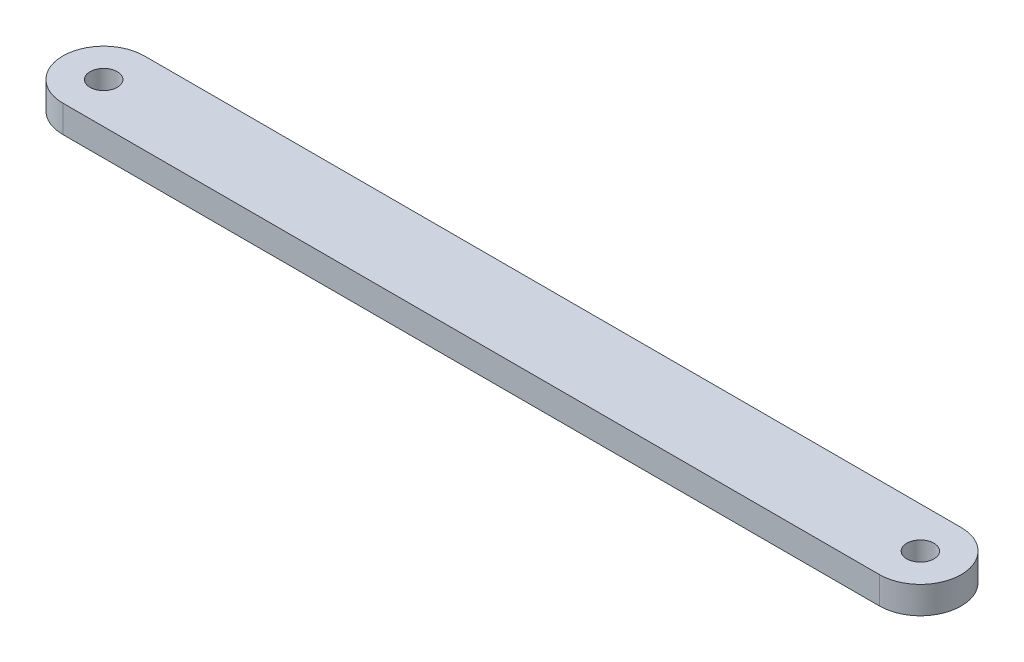
ISO-10303-21;
HEADER;
FILE_DESCRIPTION(('STEP AP214'),'2;1');
FILE_NAME('part.step','',(''),(''),'','','');
FILE_SCHEMA(('AUTOMOTIVE_DESIGN { 1 0 10303 214 1 1 1 1 }'));
ENDSEC;
DATA;
#1=APPLICATION_CONTEXT('core data for automotive mechanical design processes');
#2=APPLICATION_PROTOCOL_DEFINITION('international standard','automotive_design',2000,#1);
#3=PRODUCT_CONTEXT('',#1,'mechanical');
#4=PRODUCT('Part','Part','',(#3));
#5=PRODUCT_RELATED_PRODUCT_CATEGORY('part','',(#4));
#6=PRODUCT_DEFINITION_FORMATION('','',#4);
#7=PRODUCT_DEFINITION_CONTEXT('part definition',#1,'design');
#8=PRODUCT_DEFINITION('design','',#6,#7);
#9=PRODUCT_DEFINITION_SHAPE('','',#8);
#10=(LENGTH_UNIT() NAMED_UNIT(*) SI_UNIT(.MILLI.,.METRE.));
#11=(NAMED_UNIT(*) PLANE_ANGLE_UNIT() SI_UNIT($,.RADIAN.));
#12=(NAMED_UNIT(*) SI_UNIT($,.STERADIAN.) SOLID_ANGLE_UNIT());
#13=UNCERTAINTY_MEASURE_WITH_UNIT(LENGTH_MEASURE(1.E-05),#10,'distance_accuracy_value','');
#14=(GEOMETRIC_REPRESENTATION_CONTEXT(3) GLOBAL_UNCERTAINTY_ASSIGNED_CONTEXT((#13)) GLOBAL_UNIT_ASSIGNED_CONTEXT((#10,
#11,#12)) REPRESENTATION_CONTEXT('',''));
#15=CARTESIAN_POINT('',(0.,0.,0.));
#16=DIRECTION('',(0.,0.,1.));
#17=DIRECTION('',(1.,0.,0.));
#18=AXIS2_PLACEMENT_3D('',#15,#16,#17);
#19=CARTESIAN_POINT('',(75.,5.,0.));
#20=DIRECTION('',(0.,-1.,0.));
#21=DIRECTION('',(0.,0.,-1.));
#22=AXIS2_PLACEMENT_3D('',#19,#20,#21);
#23=PLANE('',#22);
#24=CARTESIAN_POINT('',(75.,5.,0.));
#25=DIRECTION('',(0.,1.,0.));
#26=DIRECTION('',(0.,0.,-1.));
#27=AXIS2_PLACEMENT_3D('',#24,#25,#26);
#28=CIRCLE('',#27,7.5);
#29=CARTESIAN_POINT('',(75.,5.,7.5));
#30=VERTEX_POINT('',#29);
#31=CARTESIAN_POINT('',(75.,5.,-7.5));
#32=VERTEX_POINT('',#31);
#33=EDGE_CURVE('E86',#30,#32,#28,.T.);
#34=ORIENTED_EDGE('',*,*,#33,.T.);
#35=DIRECTION('',(-1.,0.,0.));
#36=VECTOR('',#35,1.);
#37=CARTESIAN_POINT('',(-75.,5.,-7.5));
#38=LINE('',#37,#36);
#39=CARTESIAN_POINT('',(-75.,5.,-7.5));
#40=VERTEX_POINT('',#39);
#41=EDGE_CURVE('E81',#32,#40,#38,.T.);
#42=ORIENTED_EDGE('',*,*,#41,.T.);
#43=CARTESIAN_POINT('',(-75.,5.,0.));
#44=DIRECTION('',(0.,1.,0.));
#45=DIRECTION('',(0.,0.,1.));
#46=AXIS2_PLACEMENT_3D('',#43,#44,#45);
#47=CIRCLE('',#46,7.5);
#48=CARTESIAN_POINT('',(-75.,5.,7.5));
#49=VERTEX_POINT('',#48);
#50=EDGE_CURVE('E84',#40,#49,#47,.T.);
#51=ORIENTED_EDGE('',*,*,#50,.T.);
#52=DIRECTION('',(1.,0.,0.));
#53=VECTOR('',#52,1.);
#54=CARTESIAN_POINT('',(-75.,5.,7.5));
#55=LINE('',#54,#53);
#56=EDGE_CURVE('E51',#49,#30,#55,.T.);
#57=ORIENTED_EDGE('',*,*,#56,.T.);
#58=EDGE_LOOP('',(#34,#42,#51,#57));
#59=FACE_BOUND('',#58,.T.);
#60=CARTESIAN_POINT('',(-75.,5.,0.));
#61=DIRECTION('',(0.,1.,0.));
#62=DIRECTION('',(0.,0.,1.));
#63=AXIS2_PLACEMENT_3D('',#60,#61,#62);
#64=CIRCLE('',#63,2.5);
#65=CARTESIAN_POINT('',(-75.,5.,2.49999999999999));
#66=VERTEX_POINT('',#65);
#67=EDGE_CURVE('E101',#66,#66,#64,.T.);
#68=ORIENTED_EDGE('',*,*,#67,.F.);
#69=EDGE_LOOP('',(#68));
#70=FACE_BOUND('',#69,.T.);
#71=CARTESIAN_POINT('',(75.,5.,0.));
#72=DIRECTION('',(0.,1.,0.));
#73=DIRECTION('',(0.,0.,1.));
#74=AXIS2_PLACEMENT_3D('',#71,#72,#73);
#75=CIRCLE('',#74,2.50000000000001);
#76=CARTESIAN_POINT('',(75.,5.,2.50000000000001));
#77=VERTEX_POINT('',#76);
#78=EDGE_CURVE('E116',#77,#77,#75,.T.);
#79=ORIENTED_EDGE('',*,*,#78,.F.);
#80=EDGE_LOOP('',(#79));
#81=FACE_BOUND('',#80,.T.);
#82=ADVANCED_FACE('F34',(#59,#70,#81),#23,.F.);
#83=CARTESIAN_POINT('',(75.,0.,0.));
#84=DIRECTION('',(0.,-1.,0.));
#85=DIRECTION('',(0.,0.,-1.));
#86=AXIS2_PLACEMENT_3D('',#83,#84,#85);
#87=PLANE('',#86);
#88=CARTESIAN_POINT('',(-75.,0.,0.));
#89=DIRECTION('',(0.,1.,0.));
#90=DIRECTION('',(0.,0.,1.));
#91=AXIS2_PLACEMENT_3D('',#88,#89,#90);
#92=CIRCLE('',#91,2.5);
#93=CARTESIAN_POINT('',(-75.,0.,2.49999999999999));
#94=VERTEX_POINT('',#93);
#95=EDGE_CURVE('E113',#94,#94,#92,.T.);
#96=ORIENTED_EDGE('',*,*,#95,.T.);
#97=EDGE_LOOP('',(#96));
#98=FACE_BOUND('',#97,.T.);
#99=CARTESIAN_POINT('',(75.,0.,0.));
#100=DIRECTION('',(0.,1.,0.));
#101=DIRECTION('',(0.,0.,-1.));
#102=AXIS2_PLACEMENT_3D('',#99,#100,#101);
#103=CIRCLE('',#102,7.5);
#104=CARTESIAN_POINT('',(75.,0.,7.5));
#105=VERTEX_POINT('',#104);
#106=CARTESIAN_POINT('',(75.,0.,-7.5));
#107=VERTEX_POINT('',#106);
#108=EDGE_CURVE('E98',#105,#107,#103,.T.);
#109=ORIENTED_EDGE('',*,*,#108,.F.);
#110=DIRECTION('',(1.,0.,0.));
#111=VECTOR('',#110,1.);
#112=CARTESIAN_POINT('',(-75.,0.,7.5));
#113=LINE('',#112,#111);
#114=CARTESIAN_POINT('',(-75.,0.,7.5));
#115=VERTEX_POINT('',#114);
#116=EDGE_CURVE('E74',#115,#105,#113,.T.);
#117=ORIENTED_EDGE('',*,*,#116,.F.);
#118=CARTESIAN_POINT('',(-75.,0.,0.));
#119=DIRECTION('',(0.,1.,0.));
#120=DIRECTION('',(0.,0.,1.));
#121=AXIS2_PLACEMENT_3D('',#118,#119,#120);
#122=CIRCLE('',#121,7.5);
#123=CARTESIAN_POINT('',(-75.,0.,-7.5));
#124=VERTEX_POINT('',#123);
#125=EDGE_CURVE('E68',#124,#115,#122,.T.);
#126=ORIENTED_EDGE('',*,*,#125,.F.);
#127=DIRECTION('',(-1.,0.,0.));
#128=VECTOR('',#127,1.);
#129=CARTESIAN_POINT('',(-75.,0.,-7.5));
#130=LINE('',#129,#128);
#131=EDGE_CURVE('E90',#107,#124,#130,.T.);
#132=ORIENTED_EDGE('',*,*,#131,.F.);
#133=EDGE_LOOP('',(#109,#117,#126,#132));
#134=FACE_BOUND('',#133,.T.);
#135=CARTESIAN_POINT('',(75.,0.,0.));
#136=DIRECTION('',(0.,1.,0.));
#137=DIRECTION('',(0.,0.,1.));
#138=AXIS2_PLACEMENT_3D('',#135,#136,#137);
#139=CIRCLE('',#138,2.50000000000001);
#140=CARTESIAN_POINT('',(75.,0.,2.50000000000001));
#141=VERTEX_POINT('',#140);
#142=EDGE_CURVE('E119',#141,#141,#139,.T.);
#143=ORIENTED_EDGE('',*,*,#142,.T.);
#144=EDGE_LOOP('',(#143));
#145=FACE_BOUND('',#144,.T.);
#146=ADVANCED_FACE('F109',(#98,#134,#145),#87,.T.);
#147=CARTESIAN_POINT('',(75.,5.,0.));
#148=DIRECTION('',(0.,-1.,0.));
#149=DIRECTION('',(0.,0.,-1.));
#150=AXIS2_PLACEMENT_3D('',#147,#148,#149);
#151=CYLINDRICAL_SURFACE('',#150,7.5);
#152=ORIENTED_EDGE('',*,*,#108,.T.);
#153=DIRECTION('',(0.,-1.,0.));
#154=VECTOR('',#153,1.);
#155=CARTESIAN_POINT('',(75.,5.,-7.5));
#156=LINE('',#155,#154);
#157=EDGE_CURVE('E11',#32,#107,#156,.T.);
#158=ORIENTED_EDGE('',*,*,#157,.F.);
#159=ORIENTED_EDGE('',*,*,#33,.F.);
#160=DIRECTION('',(0.,-1.,0.));
#161=VECTOR('',#160,1.);
#162=CARTESIAN_POINT('',(75.,5.,7.5));
#163=LINE('',#162,#161);
#164=EDGE_CURVE('E94',#30,#105,#163,.T.);
#165=ORIENTED_EDGE('',*,*,#164,.T.);
#166=EDGE_LOOP('',(#152,#158,#159,#165));
#167=FACE_BOUND('',#166,.T.);
#168=ADVANCED_FACE('F36',(#167),#151,.T.);
#169=CARTESIAN_POINT('',(-75.,5.,-7.5));
#170=DIRECTION('',(0.,0.,1.));
#171=DIRECTION('',(1.,0.,0.));
#172=AXIS2_PLACEMENT_3D('',#169,#170,#171);
#173=PLANE('',#172);
#174=ORIENTED_EDGE('',*,*,#131,.T.);
#175=DIRECTION('',(0.,-1.,0.));
#176=VECTOR('',#175,1.);
#177=CARTESIAN_POINT('',(-75.,5.,-7.5));
#178=LINE('',#177,#176);
#179=EDGE_CURVE('E43',#40,#124,#178,.T.);
#180=ORIENTED_EDGE('',*,*,#179,.F.);
#181=ORIENTED_EDGE('',*,*,#41,.F.);
#182=ORIENTED_EDGE('',*,*,#157,.T.);
#183=EDGE_LOOP('',(#174,#180,#181,#182));
#184=FACE_BOUND('',#183,.T.);
#185=ADVANCED_FACE('F89',(#184),#173,.F.);
#186=CARTESIAN_POINT('',(-75.,5.,0.));
#187=DIRECTION('',(0.,-1.,0.));
#188=DIRECTION('',(0.,0.,-1.));
#189=AXIS2_PLACEMENT_3D('',#186,#187,#188);
#190=CYLINDRICAL_SURFACE('',#189,7.5);
#191=ORIENTED_EDGE('',*,*,#125,.T.);
#192=DIRECTION('',(0.,-1.,0.));
#193=VECTOR('',#192,1.);
#194=CARTESIAN_POINT('',(-75.,5.,7.5));
#195=LINE('',#194,#193);
#196=EDGE_CURVE('E91',#49,#115,#195,.T.);
#197=ORIENTED_EDGE('',*,*,#196,.F.);
#198=ORIENTED_EDGE('',*,*,#50,.F.);
#199=ORIENTED_EDGE('',*,*,#179,.T.);
#200=EDGE_LOOP('',(#191,#197,#198,#199));
#201=FACE_BOUND('',#200,.T.);
#202=ADVANCED_FACE('F92',(#201),#190,.T.);
#203=CARTESIAN_POINT('',(-75.,5.,7.5));
#204=DIRECTION('',(0.,0.,-1.));
#205=DIRECTION('',(-1.,0.,0.));
#206=AXIS2_PLACEMENT_3D('',#203,#204,#205);
#207=PLANE('',#206);
#208=ORIENTED_EDGE('',*,*,#116,.T.);
#209=ORIENTED_EDGE('',*,*,#164,.F.);
#210=ORIENTED_EDGE('',*,*,#56,.F.);
#211=ORIENTED_EDGE('',*,*,#196,.T.);
#212=EDGE_LOOP('',(#208,#209,#210,#211));
#213=FACE_BOUND('',#212,.T.);
#214=ADVANCED_FACE('F106',(#213),#207,.F.);
#215=CARTESIAN_POINT('',(-75.,5.,0.));
#216=DIRECTION('',(0.,-1.,0.));
#217=DIRECTION('',(0.,0.,-1.));
#218=AXIS2_PLACEMENT_3D('',#215,#216,#217);
#219=CYLINDRICAL_SURFACE('',#218,2.5);
#220=ORIENTED_EDGE('',*,*,#67,.T.);
#221=EDGE_LOOP('',(#220));
#222=FACE_BOUND('',#221,.T.);
#223=ORIENTED_EDGE('',*,*,#95,.F.);
#224=EDGE_LOOP('',(#223));
#225=FACE_BOUND('',#224,.T.);
#226=ADVANCED_FACE('F136',(#222,#225),#219,.F.);
#227=CARTESIAN_POINT('',(75.,5.,0.));
#228=DIRECTION('',(0.,-1.,0.));
#229=DIRECTION('',(0.,0.,-1.));
#230=AXIS2_PLACEMENT_3D('',#227,#228,#229);
#231=CYLINDRICAL_SURFACE('',#230,2.50000000000001);
#232=ORIENTED_EDGE('',*,*,#78,.T.);
#233=EDGE_LOOP('',(#232));
#234=FACE_BOUND('',#233,.T.);
#235=ORIENTED_EDGE('',*,*,#142,.F.);
#236=EDGE_LOOP('',(#235));
#237=FACE_BOUND('',#236,.T.);
#238=ADVANCED_FACE('F125',(#234,#237),#231,.F.);
#239=CLOSED_SHELL('',(#82,#146,#168,#185,#202,#214,#226,#238));
#240=MANIFOLD_SOLID_BREP('B2',#239);
#241=ADVANCED_BREP_SHAPE_REPRESENTATION('',(#18,#240),#14);
#242=SHAPE_DEFINITION_REPRESENTATION(#9,#241);
ENDSEC;
END-ISO-10303-21;
